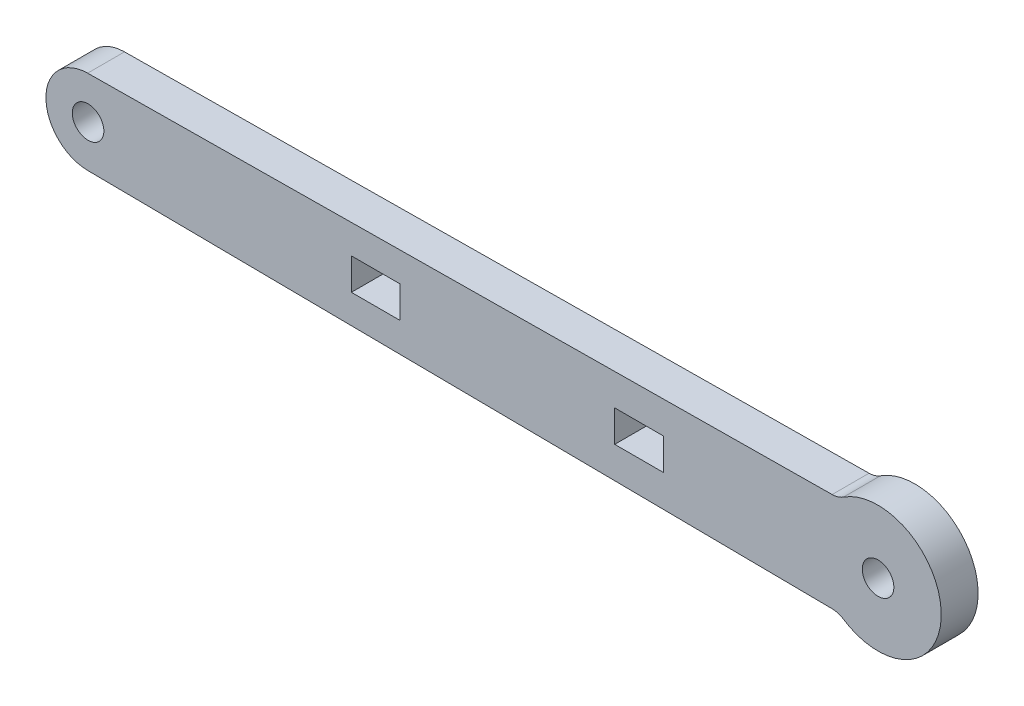
ISO-10303-21;
HEADER;
FILE_DESCRIPTION(('STEP AP214'),'2;1');
FILE_NAME('part.step','',(''),(''),'','','');
FILE_SCHEMA(('AUTOMOTIVE_DESIGN { 1 0 10303 214 1 1 1 1 }'));
ENDSEC;
DATA;
#1=APPLICATION_CONTEXT('core data for automotive mechanical design processes');
#2=APPLICATION_PROTOCOL_DEFINITION('international standard','automotive_design',2000,#1);
#3=PRODUCT_CONTEXT('',#1,'mechanical');
#4=PRODUCT('Part','Part','',(#3));
#5=PRODUCT_RELATED_PRODUCT_CATEGORY('part','',(#4));
#6=PRODUCT_DEFINITION_FORMATION('','',#4);
#7=PRODUCT_DEFINITION_CONTEXT('part definition',#1,'design');
#8=PRODUCT_DEFINITION('design','',#6,#7);
#9=PRODUCT_DEFINITION_SHAPE('','',#8);
#10=(LENGTH_UNIT() NAMED_UNIT(*) SI_UNIT(.MILLI.,.METRE.));
#11=(NAMED_UNIT(*) PLANE_ANGLE_UNIT() SI_UNIT($,.RADIAN.));
#12=(NAMED_UNIT(*) SI_UNIT($,.STERADIAN.) SOLID_ANGLE_UNIT());
#13=UNCERTAINTY_MEASURE_WITH_UNIT(LENGTH_MEASURE(1.E-05),#10,'distance_accuracy_value','');
#14=(GEOMETRIC_REPRESENTATION_CONTEXT(3) GLOBAL_UNCERTAINTY_ASSIGNED_CONTEXT((#13)) GLOBAL_UNIT_ASSIGNED_CONTEXT((#10,
#11,#12)) REPRESENTATION_CONTEXT('',''));
#15=CARTESIAN_POINT('',(0.,0.,0.));
#16=DIRECTION('',(0.,0.,1.));
#17=DIRECTION('',(1.,0.,0.));
#18=AXIS2_PLACEMENT_3D('',#15,#16,#17);
#19=CARTESIAN_POINT('',(-0.0467366776181437,-4.73934084459366,3.5));
#20=DIRECTION('',(0.00986095045635902,0.999951379646079,0.));
#21=DIRECTION('',(-0.999951379646079,0.00986095045635902,0.));
#22=AXIS2_PLACEMENT_3D('',#19,#20,#21);
#23=PLANE('',#22);
#24=DIRECTION('',(0.999951379646079,-0.00986095045635902,0.));
#25=VECTOR('',#24,1.);
#26=CARTESIAN_POINT('',(-0.0467366776181437,-4.73934084459366,0.));
#27=LINE('',#26,#25);
#28=CARTESIAN_POINT('',(-75.0394438018254,-3.99980551858433,0.));
#29=VERTEX_POINT('',#28);
#30=CARTESIAN_POINT('',(-4.35676827767333,-4.69683777000565,0.));
#31=VERTEX_POINT('',#30);
#32=EDGE_CURVE('E226',#29,#31,#27,.T.);
#33=ORIENTED_EDGE('',*,*,#32,.T.);
#34=DIRECTION('',(0.,0.,1.));
#35=VECTOR('',#34,1.);
#36=CARTESIAN_POINT('',(-4.35676827767333,-4.69683777000565,3.5));
#37=LINE('',#36,#35);
#38=CARTESIAN_POINT('',(-4.35676827767333,-4.69683777000565,3.5));
#39=VERTEX_POINT('',#38);
#40=EDGE_CURVE('E257',#31,#39,#37,.T.);
#41=ORIENTED_EDGE('',*,*,#40,.T.);
#42=DIRECTION('',(0.999951379646079,-0.00986095045635902,0.));
#43=VECTOR('',#42,1.);
#44=CARTESIAN_POINT('',(-0.0467366776181437,-4.73934084459366,3.5));
#45=LINE('',#44,#43);
#46=CARTESIAN_POINT('',(-75.0394438018254,-3.99980551858433,3.5));
#47=VERTEX_POINT('',#46);
#48=EDGE_CURVE('E190',#47,#39,#45,.T.);
#49=ORIENTED_EDGE('',*,*,#48,.F.);
#50=DIRECTION('',(0.,0.,-1.));
#51=VECTOR('',#50,1.);
#52=CARTESIAN_POINT('',(-75.0394438018254,-3.99980551858433,3.5));
#53=LINE('',#52,#51);
#54=EDGE_CURVE('E236',#47,#29,#53,.T.);
#55=ORIENTED_EDGE('',*,*,#54,.T.);
#56=EDGE_LOOP('',(#33,#41,#49,#55));
#57=FACE_BOUND('',#56,.T.);
#58=ADVANCED_FACE('F40',(#57),#23,.F.);
#59=CARTESIAN_POINT('',(0.,0.,3.5));
#60=DIRECTION('',(0.,0.,-1.));
#61=DIRECTION('',(-1.,0.,0.));
#62=AXIS2_PLACEMENT_3D('',#59,#60,#61);
#63=CYLINDRICAL_SURFACE('',#62,6.);
#64=CARTESIAN_POINT('',(0.,0.,3.5));
#65=DIRECTION('',(0.,0.,1.));
#66=DIRECTION('',(1.,0.,0.));
#67=AXIS2_PLACEMENT_3D('',#64,#65,#66);
#68=CIRCLE('',#67,6.);
#69=CARTESIAN_POINT('',(-3.28236763393953,-5.02255539697336,3.5));
#70=VERTEX_POINT('',#69);
#71=CARTESIAN_POINT('',(-3.28236763393954,5.02255539697335,3.5));
#72=VERTEX_POINT('',#71);
#73=EDGE_CURVE('E193',#70,#72,#68,.T.);
#74=ORIENTED_EDGE('',*,*,#73,.F.);
#75=DIRECTION('',(0.,0.,-1.));
#76=VECTOR('',#75,1.);
#77=CARTESIAN_POINT('',(-3.28236763393954,-5.02255539697336,3.5));
#78=LINE('',#77,#76);
#79=CARTESIAN_POINT('',(-3.28236763393953,-5.02255539697336,0.));
#80=VERTEX_POINT('',#79);
#81=EDGE_CURVE('E254',#70,#80,#78,.T.);
#82=ORIENTED_EDGE('',*,*,#81,.T.);
#83=CARTESIAN_POINT('',(0.,0.,0.));
#84=DIRECTION('',(0.,0.,1.));
#85=DIRECTION('',(1.,0.,0.));
#86=AXIS2_PLACEMENT_3D('',#83,#84,#85);
#87=CIRCLE('',#86,6.);
#88=CARTESIAN_POINT('',(-3.28236763393954,5.02255539697335,0.));
#89=VERTEX_POINT('',#88);
#90=EDGE_CURVE('E229',#80,#89,#87,.T.);
#91=ORIENTED_EDGE('',*,*,#90,.T.);
#92=DIRECTION('',(0.,0.,-1.));
#93=VECTOR('',#92,1.);
#94=CARTESIAN_POINT('',(-3.28236763393954,5.02255539697335,3.5));
#95=LINE('',#94,#93);
#96=EDGE_CURVE('E242',#89,#72,#95,.F.);
#97=ORIENTED_EDGE('',*,*,#96,.T.);
#98=EDGE_LOOP('',(#74,#82,#91,#97));
#99=FACE_BOUND('',#98,.T.);
#100=ADVANCED_FACE('F272',(#99),#63,.T.);
#101=CARTESIAN_POINT('',(-0.0467366776181448,4.73934084459366,3.5));
#102=DIRECTION('',(-0.00986095045635926,0.999951379646079,0.));
#103=DIRECTION('',(-0.999951379646079,-0.00986095045635926,0.));
#104=AXIS2_PLACEMENT_3D('',#101,#102,#103);
#105=PLANE('',#104);
#106=DIRECTION('',(0.999951379646079,0.00986095045635926,0.));
#107=VECTOR('',#106,1.);
#108=CARTESIAN_POINT('',(-0.0467366776181448,4.73934084459366,3.5));
#109=LINE('',#108,#107);
#110=CARTESIAN_POINT('',(-75.0394438018254,3.99980551858431,3.5));
#111=VERTEX_POINT('',#110);
#112=CARTESIAN_POINT('',(-4.35676827767333,4.69683777000565,3.5));
#113=VERTEX_POINT('',#112);
#114=EDGE_CURVE('E195',#111,#113,#109,.T.);
#115=ORIENTED_EDGE('',*,*,#114,.T.);
#116=DIRECTION('',(0.,0.,-1.));
#117=VECTOR('',#116,1.);
#118=CARTESIAN_POINT('',(-4.35676827767333,4.69683777000565,3.5));
#119=LINE('',#118,#117);
#120=CARTESIAN_POINT('',(-4.35676827767333,4.69683777000565,0.));
#121=VERTEX_POINT('',#120);
#122=EDGE_CURVE('E259',#113,#121,#119,.T.);
#123=ORIENTED_EDGE('',*,*,#122,.T.);
#124=DIRECTION('',(0.999951379646079,0.00986095045635926,0.));
#125=VECTOR('',#124,1.);
#126=CARTESIAN_POINT('',(-0.0467366776181448,4.73934084459366,0.));
#127=LINE('',#126,#125);
#128=CARTESIAN_POINT('',(-75.0394438018254,3.99980551858431,0.));
#129=VERTEX_POINT('',#128);
#130=EDGE_CURVE('E232',#129,#121,#127,.T.);
#131=ORIENTED_EDGE('',*,*,#130,.F.);
#132=DIRECTION('',(0.,0.,-1.));
#133=VECTOR('',#132,1.);
#134=CARTESIAN_POINT('',(-75.0394438018254,3.99980551858431,3.5));
#135=LINE('',#134,#133);
#136=EDGE_CURVE('E239',#111,#129,#135,.T.);
#137=ORIENTED_EDGE('',*,*,#136,.F.);
#138=EDGE_LOOP('',(#115,#123,#131,#137));
#139=FACE_BOUND('',#138,.T.);
#140=ADVANCED_FACE('F275',(#139),#105,.T.);
#141=CARTESIAN_POINT('',(0.,1.50000000000562,3.5));
#142=DIRECTION('',(0.,1.,0.));
#143=DIRECTION('',(0.,0.,1.));
#144=AXIS2_PLACEMENT_3D('',#141,#142,#143);
#145=PLANE('',#144);
#146=DIRECTION('',(1.,0.,0.));
#147=VECTOR('',#146,1.);
#148=CARTESIAN_POINT('',(0.,1.50000000000562,0.));
#149=LINE('',#148,#147);
#150=CARTESIAN_POINT('',(-50.,1.50000000000581,0.));
#151=VERTEX_POINT('',#150);
#152=CARTESIAN_POINT('',(-45.3649163380923,1.50000000000562,0.));
#153=VERTEX_POINT('',#152);
#154=EDGE_CURVE('E208',#151,#153,#149,.T.);
#155=ORIENTED_EDGE('',*,*,#154,.T.);
#156=DIRECTION('',(0.,0.,-1.));
#157=VECTOR('',#156,1.);
#158=CARTESIAN_POINT('',(-45.3649163380923,1.50000000000562,3.5));
#159=LINE('',#158,#157);
#160=CARTESIAN_POINT('',(-45.3649163380923,1.50000000000562,3.5));
#161=VERTEX_POINT('',#160);
#162=EDGE_CURVE('E240',#161,#153,#159,.T.);
#163=ORIENTED_EDGE('',*,*,#162,.F.);
#164=DIRECTION('',(1.,0.,0.));
#165=VECTOR('',#164,1.);
#166=CARTESIAN_POINT('',(0.,1.50000000000562,3.5));
#167=LINE('',#166,#165);
#168=CARTESIAN_POINT('',(-50.,1.50000000000581,3.5));
#169=VERTEX_POINT('',#168);
#170=EDGE_CURVE('E173',#169,#161,#167,.T.);
#171=ORIENTED_EDGE('',*,*,#170,.F.);
#172=DIRECTION('',(0.,0.,-1.));
#173=VECTOR('',#172,1.);
#174=CARTESIAN_POINT('',(-50.,1.50000000000581,3.5));
#175=LINE('',#174,#173);
#176=EDGE_CURVE('E164',#169,#151,#175,.T.);
#177=ORIENTED_EDGE('',*,*,#176,.T.);
#178=EDGE_LOOP('',(#155,#163,#171,#177));
#179=FACE_BOUND('',#178,.T.);
#180=ADVANCED_FACE('F323',(#179),#145,.F.);
#181=CARTESIAN_POINT('',(-45.3649163380923,-1.04927447143217E-13,3.5));
#182=DIRECTION('',(-1.,0.,0.));
#183=DIRECTION('',(0.,-1.,0.));
#184=AXIS2_PLACEMENT_3D('',#181,#182,#183);
#185=PLANE('',#184);
#186=DIRECTION('',(0.,1.,0.));
#187=VECTOR('',#186,1.);
#188=CARTESIAN_POINT('',(-45.3649163380923,-1.04927447143217E-13,0.));
#189=LINE('',#188,#187);
#190=CARTESIAN_POINT('',(-45.3649163380923,-1.49999999999438,0.));
#191=VERTEX_POINT('',#190);
#192=EDGE_CURVE('E211',#191,#153,#189,.T.);
#193=ORIENTED_EDGE('',*,*,#192,.F.);
#194=DIRECTION('',(0.,0.,-1.));
#195=VECTOR('',#194,1.);
#196=CARTESIAN_POINT('',(-45.3649163380923,-1.49999999999438,3.5));
#197=LINE('',#196,#195);
#198=CARTESIAN_POINT('',(-45.3649163380923,-1.49999999999438,3.5));
#199=VERTEX_POINT('',#198);
#200=EDGE_CURVE('E246',#199,#191,#197,.T.);
#201=ORIENTED_EDGE('',*,*,#200,.F.);
#202=DIRECTION('',(0.,1.,0.));
#203=VECTOR('',#202,1.);
#204=CARTESIAN_POINT('',(-45.3649163380923,-1.04927447143217E-13,3.5));
#205=LINE('',#204,#203);
#206=EDGE_CURVE('E175',#199,#161,#205,.T.);
#207=ORIENTED_EDGE('',*,*,#206,.T.);
#208=ORIENTED_EDGE('',*,*,#162,.T.);
#209=EDGE_LOOP('',(#193,#201,#207,#208));
#210=FACE_BOUND('',#209,.T.);
#211=ADVANCED_FACE('F319',(#210),#185,.T.);
#212=CARTESIAN_POINT('',(0.,-1.49999999999419,3.5));
#213=DIRECTION('',(0.,1.,0.));
#214=DIRECTION('',(0.,0.,1.));
#215=AXIS2_PLACEMENT_3D('',#212,#213,#214);
#216=PLANE('',#215);
#217=DIRECTION('',(1.,0.,0.));
#218=VECTOR('',#217,1.);
#219=CARTESIAN_POINT('',(0.,-1.49999999999419,0.));
#220=LINE('',#219,#218);
#221=CARTESIAN_POINT('',(-50.,-1.49999999999419,0.));
#222=VERTEX_POINT('',#221);
#223=EDGE_CURVE('E214',#222,#191,#220,.T.);
#224=ORIENTED_EDGE('',*,*,#223,.F.);
#225=DIRECTION('',(0.,0.,-1.));
#226=VECTOR('',#225,1.);
#227=CARTESIAN_POINT('',(-50.,-1.49999999999419,3.5));
#228=LINE('',#227,#226);
#229=CARTESIAN_POINT('',(-50.,-1.49999999999419,3.5));
#230=VERTEX_POINT('',#229);
#231=EDGE_CURVE('E244',#230,#222,#228,.T.);
#232=ORIENTED_EDGE('',*,*,#231,.F.);
#233=DIRECTION('',(1.,0.,0.));
#234=VECTOR('',#233,1.);
#235=CARTESIAN_POINT('',(0.,-1.49999999999419,3.5));
#236=LINE('',#235,#234);
#237=EDGE_CURVE('E178',#230,#199,#236,.T.);
#238=ORIENTED_EDGE('',*,*,#237,.T.);
#239=ORIENTED_EDGE('',*,*,#200,.T.);
#240=EDGE_LOOP('',(#224,#232,#238,#239));
#241=FACE_BOUND('',#240,.T.);
#242=ADVANCED_FACE('F316',(#241),#216,.T.);
#243=CARTESIAN_POINT('',(0.,1.50000000000562,3.5));
#244=DIRECTION('',(0.,1.,0.));
#245=DIRECTION('',(0.,0.,1.));
#246=AXIS2_PLACEMENT_3D('',#243,#244,#245);
#247=PLANE('',#246);
#248=DIRECTION('',(1.,0.,0.));
#249=VECTOR('',#248,1.);
#250=CARTESIAN_POINT('',(0.,1.50000000000562,0.));
#251=LINE('',#250,#249);
#252=CARTESIAN_POINT('',(-25.,1.50000000000562,0.));
#253=VERTEX_POINT('',#252);
#254=CARTESIAN_POINT('',(-20.3649163380923,1.50000000000562,0.));
#255=VERTEX_POINT('',#254);
#256=EDGE_CURVE('E160',#253,#255,#251,.T.);
#257=ORIENTED_EDGE('',*,*,#256,.T.);
#258=DIRECTION('',(0.,0.,-1.));
#259=VECTOR('',#258,1.);
#260=CARTESIAN_POINT('',(-20.3649163380923,1.50000000000562,3.5));
#261=LINE('',#260,#259);
#262=CARTESIAN_POINT('',(-20.3649163380923,1.50000000000562,3.5));
#263=VERTEX_POINT('',#262);
#264=EDGE_CURVE('E157',#263,#255,#261,.T.);
#265=ORIENTED_EDGE('',*,*,#264,.F.);
#266=DIRECTION('',(1.,0.,0.));
#267=VECTOR('',#266,1.);
#268=CARTESIAN_POINT('',(0.,1.50000000000562,3.5));
#269=LINE('',#268,#267);
#270=CARTESIAN_POINT('',(-25.,1.50000000000562,3.5));
#271=VERTEX_POINT('',#270);
#272=EDGE_CURVE('E141',#271,#263,#269,.T.);
#273=ORIENTED_EDGE('',*,*,#272,.F.);
#274=DIRECTION('',(0.,0.,-1.));
#275=VECTOR('',#274,1.);
#276=CARTESIAN_POINT('',(-25.,1.50000000000562,3.5));
#277=LINE('',#276,#275);
#278=EDGE_CURVE('E199',#271,#253,#277,.T.);
#279=ORIENTED_EDGE('',*,*,#278,.T.);
#280=EDGE_LOOP('',(#257,#265,#273,#279));
#281=FACE_BOUND('',#280,.T.);
#282=ADVANCED_FACE('F158',(#281),#247,.F.);
#283=CARTESIAN_POINT('',(-20.3649163380923,0.,3.5));
#284=DIRECTION('',(-1.,0.,0.));
#285=DIRECTION('',(0.,0.,1.));
#286=AXIS2_PLACEMENT_3D('',#283,#284,#285);
#287=PLANE('',#286);
#288=DIRECTION('',(0.,1.,0.));
#289=VECTOR('',#288,1.);
#290=CARTESIAN_POINT('',(-20.3649163380923,0.,0.));
#291=LINE('',#290,#289);
#292=CARTESIAN_POINT('',(-20.3649163380923,-1.49999999999419,0.));
#293=VERTEX_POINT('',#292);
#294=EDGE_CURVE('E201',#293,#255,#291,.T.);
#295=ORIENTED_EDGE('',*,*,#294,.F.);
#296=DIRECTION('',(0.,0.,-1.));
#297=VECTOR('',#296,1.);
#298=CARTESIAN_POINT('',(-20.3649163380923,-1.49999999999419,3.5));
#299=LINE('',#298,#297);
#300=CARTESIAN_POINT('',(-20.3649163380923,-1.49999999999419,3.5));
#301=VERTEX_POINT('',#300);
#302=EDGE_CURVE('E165',#301,#293,#299,.T.);
#303=ORIENTED_EDGE('',*,*,#302,.F.);
#304=DIRECTION('',(0.,1.,0.));
#305=VECTOR('',#304,1.);
#306=CARTESIAN_POINT('',(-20.3649163380923,0.,3.5));
#307=LINE('',#306,#305);
#308=EDGE_CURVE('E147',#301,#263,#307,.T.);
#309=ORIENTED_EDGE('',*,*,#308,.T.);
#310=ORIENTED_EDGE('',*,*,#264,.T.);
#311=EDGE_LOOP('',(#295,#303,#309,#310));
#312=FACE_BOUND('',#311,.T.);
#313=ADVANCED_FACE('F167',(#312),#287,.T.);
#314=CARTESIAN_POINT('',(0.,-1.49999999999419,3.5));
#315=DIRECTION('',(0.,1.,0.));
#316=DIRECTION('',(0.,0.,1.));
#317=AXIS2_PLACEMENT_3D('',#314,#315,#316);
#318=PLANE('',#317);
#319=DIRECTION('',(1.,0.,0.));
#320=VECTOR('',#319,1.);
#321=CARTESIAN_POINT('',(0.,-1.49999999999419,0.));
#322=LINE('',#321,#320);
#323=CARTESIAN_POINT('',(-25.,-1.49999999999419,0.));
#324=VERTEX_POINT('',#323);
#325=EDGE_CURVE('E203',#324,#293,#322,.T.);
#326=ORIENTED_EDGE('',*,*,#325,.F.);
#327=DIRECTION('',(0.,0.,-1.));
#328=VECTOR('',#327,1.);
#329=CARTESIAN_POINT('',(-25.,-1.49999999999419,3.5));
#330=LINE('',#329,#328);
#331=CARTESIAN_POINT('',(-25.,-1.49999999999419,3.5));
#332=VERTEX_POINT('',#331);
#333=EDGE_CURVE('E250',#332,#324,#330,.T.);
#334=ORIENTED_EDGE('',*,*,#333,.F.);
#335=DIRECTION('',(1.,0.,0.));
#336=VECTOR('',#335,1.);
#337=CARTESIAN_POINT('',(0.,-1.49999999999419,3.5));
#338=LINE('',#337,#336);
#339=EDGE_CURVE('E168',#332,#301,#338,.T.);
#340=ORIENTED_EDGE('',*,*,#339,.T.);
#341=ORIENTED_EDGE('',*,*,#302,.T.);
#342=EDGE_LOOP('',(#326,#334,#340,#341));
#343=FACE_BOUND('',#342,.T.);
#344=ADVANCED_FACE('F306',(#343),#318,.T.);
#345=CARTESIAN_POINT('',(0.,0.,3.5));
#346=DIRECTION('',(0.,0.,-1.));
#347=DIRECTION('',(-1.,0.,0.));
#348=AXIS2_PLACEMENT_3D('',#345,#346,#347);
#349=CYLINDRICAL_SURFACE('',#348,1.5);
#350=CARTESIAN_POINT('',(0.,0.,3.5));
#351=DIRECTION('',(0.,0.,1.));
#352=DIRECTION('',(1.,0.,0.));
#353=AXIS2_PLACEMENT_3D('',#350,#351,#352);
#354=CIRCLE('',#353,1.5);
#355=CARTESIAN_POINT('',(1.5,0.,3.5));
#356=VERTEX_POINT('',#355);
#357=EDGE_CURVE('E187',#356,#356,#354,.T.);
#358=ORIENTED_EDGE('',*,*,#357,.T.);
#359=EDGE_LOOP('',(#358));
#360=FACE_BOUND('',#359,.T.);
#361=CARTESIAN_POINT('',(0.,0.,0.));
#362=DIRECTION('',(0.,0.,1.));
#363=DIRECTION('',(1.,0.,0.));
#364=AXIS2_PLACEMENT_3D('',#361,#362,#363);
#365=CIRCLE('',#364,1.5);
#366=CARTESIAN_POINT('',(1.5,0.,0.));
#367=VERTEX_POINT('',#366);
#368=EDGE_CURVE('E223',#367,#367,#365,.T.);
#369=ORIENTED_EDGE('',*,*,#368,.F.);
#370=EDGE_LOOP('',(#369));
#371=FACE_BOUND('',#370,.T.);
#372=ADVANCED_FACE('F302',(#360,#371),#349,.F.);
#373=CARTESIAN_POINT('',(-75.,0.,3.5));
#374=DIRECTION('',(0.,0.,-1.));
#375=DIRECTION('',(-1.,0.,0.));
#376=AXIS2_PLACEMENT_3D('',#373,#374,#375);
#377=CYLINDRICAL_SURFACE('',#376,1.5);
#378=CARTESIAN_POINT('',(-75.,0.,3.5));
#379=DIRECTION('',(0.,0.,1.));
#380=DIRECTION('',(1.,0.,0.));
#381=AXIS2_PLACEMENT_3D('',#378,#379,#380);
#382=CIRCLE('',#381,1.5);
#383=CARTESIAN_POINT('',(-73.5,0.,3.5));
#384=VERTEX_POINT('',#383);
#385=EDGE_CURVE('E184',#384,#384,#382,.T.);
#386=ORIENTED_EDGE('',*,*,#385,.T.);
#387=EDGE_LOOP('',(#386));
#388=FACE_BOUND('',#387,.T.);
#389=CARTESIAN_POINT('',(-75.,0.,0.));
#390=DIRECTION('',(0.,0.,1.));
#391=DIRECTION('',(1.,0.,0.));
#392=AXIS2_PLACEMENT_3D('',#389,#390,#391);
#393=CIRCLE('',#392,1.5);
#394=CARTESIAN_POINT('',(-73.5,0.,0.));
#395=VERTEX_POINT('',#394);
#396=EDGE_CURVE('E220',#395,#395,#393,.T.);
#397=ORIENTED_EDGE('',*,*,#396,.F.);
#398=EDGE_LOOP('',(#397));
#399=FACE_BOUND('',#398,.T.);
#400=ADVANCED_FACE('F305',(#388,#399),#377,.F.);
#401=CARTESIAN_POINT('',(-50.,0.,3.5));
#402=DIRECTION('',(1.,0.,0.));
#403=DIRECTION('',(0.,0.,-1.));
#404=AXIS2_PLACEMENT_3D('',#401,#402,#403);
#405=PLANE('',#404);
#406=DIRECTION('',(0.,-1.,0.));
#407=VECTOR('',#406,1.);
#408=CARTESIAN_POINT('',(-50.,0.,0.));
#409=LINE('',#408,#407);
#410=EDGE_CURVE('E217',#151,#222,#409,.T.);
#411=ORIENTED_EDGE('',*,*,#410,.F.);
#412=ORIENTED_EDGE('',*,*,#176,.F.);
#413=DIRECTION('',(0.,-1.,0.));
#414=VECTOR('',#413,1.);
#415=CARTESIAN_POINT('',(-50.,0.,3.5));
#416=LINE('',#415,#414);
#417=EDGE_CURVE('E180',#169,#230,#416,.T.);
#418=ORIENTED_EDGE('',*,*,#417,.T.);
#419=ORIENTED_EDGE('',*,*,#231,.T.);
#420=EDGE_LOOP('',(#411,#412,#418,#419));
#421=FACE_BOUND('',#420,.T.);
#422=ADVANCED_FACE('F310',(#421),#405,.T.);
#423=CARTESIAN_POINT('',(-25.,0.,3.5));
#424=DIRECTION('',(-1.,0.,0.));
#425=DIRECTION('',(0.,0.,1.));
#426=AXIS2_PLACEMENT_3D('',#423,#424,#425);
#427=PLANE('',#426);
#428=DIRECTION('',(0.,1.,0.));
#429=VECTOR('',#428,1.);
#430=CARTESIAN_POINT('',(-25.,0.,0.));
#431=LINE('',#430,#429);
#432=EDGE_CURVE('E206',#324,#253,#431,.T.);
#433=ORIENTED_EDGE('',*,*,#432,.T.);
#434=ORIENTED_EDGE('',*,*,#278,.F.);
#435=DIRECTION('',(0.,1.,0.));
#436=VECTOR('',#435,1.);
#437=CARTESIAN_POINT('',(-25.,0.,3.5));
#438=LINE('',#437,#436);
#439=EDGE_CURVE('E150',#332,#271,#438,.T.);
#440=ORIENTED_EDGE('',*,*,#439,.F.);
#441=ORIENTED_EDGE('',*,*,#333,.T.);
#442=EDGE_LOOP('',(#433,#434,#440,#441));
#443=FACE_BOUND('',#442,.T.);
#444=ADVANCED_FACE('F314',(#443),#427,.F.);
#445=CARTESIAN_POINT('',(-75.,0.,3.5));
#446=DIRECTION('',(0.,0.,-1.));
#447=DIRECTION('',(-1.,0.,0.));
#448=AXIS2_PLACEMENT_3D('',#445,#446,#447);
#449=CYLINDRICAL_SURFACE('',#448,4.);
#450=CARTESIAN_POINT('',(-75.,0.,0.));
#451=DIRECTION('',(0.,0.,1.));
#452=DIRECTION('',(1.,0.,0.));
#453=AXIS2_PLACEMENT_3D('',#450,#451,#452);
#454=CIRCLE('',#453,4.);
#455=EDGE_CURVE('E154',#129,#29,#454,.T.);
#456=ORIENTED_EDGE('',*,*,#455,.T.);
#457=ORIENTED_EDGE('',*,*,#54,.F.);
#458=CARTESIAN_POINT('',(-75.,0.,3.5));
#459=DIRECTION('',(0.,0.,1.));
#460=DIRECTION('',(1.,0.,0.));
#461=AXIS2_PLACEMENT_3D('',#458,#459,#460);
#462=CIRCLE('',#461,4.);
#463=EDGE_CURVE('E197',#111,#47,#462,.T.);
#464=ORIENTED_EDGE('',*,*,#463,.F.);
#465=ORIENTED_EDGE('',*,*,#136,.T.);
#466=EDGE_LOOP('',(#456,#457,#464,#465));
#467=FACE_BOUND('',#466,.T.);
#468=ADVANCED_FACE('F281',(#467),#449,.T.);
#469=CARTESIAN_POINT('',(0.,0.,3.5));
#470=DIRECTION('',(0.,0.,1.));
#471=DIRECTION('',(1.,0.,0.));
#472=AXIS2_PLACEMENT_3D('',#469,#470,#471);
#473=PLANE('',#472);
#474=ORIENTED_EDGE('',*,*,#272,.T.);
#475=ORIENTED_EDGE('',*,*,#308,.F.);
#476=ORIENTED_EDGE('',*,*,#339,.F.);
#477=ORIENTED_EDGE('',*,*,#439,.T.);
#478=EDGE_LOOP('',(#474,#475,#476,#477));
#479=FACE_BOUND('',#478,.T.);
#480=ORIENTED_EDGE('',*,*,#170,.T.);
#481=ORIENTED_EDGE('',*,*,#206,.F.);
#482=ORIENTED_EDGE('',*,*,#237,.F.);
#483=ORIENTED_EDGE('',*,*,#417,.F.);
#484=EDGE_LOOP('',(#480,#481,#482,#483));
#485=FACE_BOUND('',#484,.T.);
#486=ORIENTED_EDGE('',*,*,#385,.F.);
#487=EDGE_LOOP('',(#486));
#488=FACE_BOUND('',#487,.T.);
#489=ORIENTED_EDGE('',*,*,#357,.F.);
#490=EDGE_LOOP('',(#489));
#491=FACE_BOUND('',#490,.T.);
#492=ORIENTED_EDGE('',*,*,#48,.T.);
#493=CARTESIAN_POINT('',(-4.37649017858605,-6.69674052929781,3.5));
#494=DIRECTION('',(0.,0.,1.));
#495=DIRECTION('',(1.,0.,0.));
#496=AXIS2_PLACEMENT_3D('',#493,#494,#495);
#497=CIRCLE('',#496,2.);
#498=EDGE_CURVE('E263',#39,#70,#497,.F.);
#499=ORIENTED_EDGE('',*,*,#498,.T.);
#500=ORIENTED_EDGE('',*,*,#73,.T.);
#501=CARTESIAN_POINT('',(-4.37649017858605,6.6967405292978,3.5));
#502=DIRECTION('',(0.,0.,1.));
#503=DIRECTION('',(1.,0.,0.));
#504=AXIS2_PLACEMENT_3D('',#501,#502,#503);
#505=CIRCLE('',#504,2.);
#506=EDGE_CURVE('E12',#72,#113,#505,.F.);
#507=ORIENTED_EDGE('',*,*,#506,.T.);
#508=ORIENTED_EDGE('',*,*,#114,.F.);
#509=ORIENTED_EDGE('',*,*,#463,.T.);
#510=EDGE_LOOP('',(#492,#499,#500,#507,#508,#509));
#511=FACE_BOUND('',#510,.T.);
#512=ADVANCED_FACE('F143',(#479,#485,#488,#491,#511),#473,.T.);
#513=CARTESIAN_POINT('',(0.,0.,0.));
#514=DIRECTION('',(0.,0.,1.));
#515=DIRECTION('',(1.,0.,0.));
#516=AXIS2_PLACEMENT_3D('',#513,#514,#515);
#517=PLANE('',#516);
#518=ORIENTED_EDGE('',*,*,#256,.F.);
#519=ORIENTED_EDGE('',*,*,#432,.F.);
#520=ORIENTED_EDGE('',*,*,#325,.T.);
#521=ORIENTED_EDGE('',*,*,#294,.T.);
#522=EDGE_LOOP('',(#518,#519,#520,#521));
#523=FACE_BOUND('',#522,.T.);
#524=ORIENTED_EDGE('',*,*,#154,.F.);
#525=ORIENTED_EDGE('',*,*,#410,.T.);
#526=ORIENTED_EDGE('',*,*,#223,.T.);
#527=ORIENTED_EDGE('',*,*,#192,.T.);
#528=EDGE_LOOP('',(#524,#525,#526,#527));
#529=FACE_BOUND('',#528,.T.);
#530=ORIENTED_EDGE('',*,*,#396,.T.);
#531=EDGE_LOOP('',(#530));
#532=FACE_BOUND('',#531,.T.);
#533=ORIENTED_EDGE('',*,*,#368,.T.);
#534=EDGE_LOOP('',(#533));
#535=FACE_BOUND('',#534,.T.);
#536=ORIENTED_EDGE('',*,*,#32,.F.);
#537=ORIENTED_EDGE('',*,*,#455,.F.);
#538=ORIENTED_EDGE('',*,*,#130,.T.);
#539=CARTESIAN_POINT('',(-4.37649017858605,6.6967405292978,0.));
#540=DIRECTION('',(0.,0.,1.));
#541=DIRECTION('',(1.,0.,0.));
#542=AXIS2_PLACEMENT_3D('',#539,#540,#541);
#543=CIRCLE('',#542,2.);
#544=EDGE_CURVE('E48',#121,#89,#543,.T.);
#545=ORIENTED_EDGE('',*,*,#544,.T.);
#546=ORIENTED_EDGE('',*,*,#90,.F.);
#547=CARTESIAN_POINT('',(-4.37649017858605,-6.69674052929781,0.));
#548=DIRECTION('',(0.,0.,1.));
#549=DIRECTION('',(1.,0.,0.));
#550=AXIS2_PLACEMENT_3D('',#547,#548,#549);
#551=CIRCLE('',#550,2.);
#552=EDGE_CURVE('E261',#80,#31,#551,.T.);
#553=ORIENTED_EDGE('',*,*,#552,.T.);
#554=EDGE_LOOP('',(#536,#537,#538,#545,#546,#553));
#555=FACE_BOUND('',#554,.T.);
#556=ADVANCED_FACE('F267',(#523,#529,#532,#535,#555),#517,.F.);
#557=CARTESIAN_POINT('',(-4.37649017858605,-6.69674052929781,3.5));
#558=DIRECTION('',(0.,0.,-1.));
#559=DIRECTION('',(-1.,0.,0.));
#560=AXIS2_PLACEMENT_3D('',#557,#558,#559);
#561=CYLINDRICAL_SURFACE('',#560,2.);
#562=ORIENTED_EDGE('',*,*,#498,.F.);
#563=ORIENTED_EDGE('',*,*,#40,.F.);
#564=ORIENTED_EDGE('',*,*,#552,.F.);
#565=ORIENTED_EDGE('',*,*,#81,.F.);
#566=EDGE_LOOP('',(#562,#563,#564,#565));
#567=FACE_BOUND('',#566,.T.);
#568=ADVANCED_FACE('F285',(#567),#561,.F.);
#569=CARTESIAN_POINT('',(-4.37649017858605,6.6967405292978,3.5));
#570=DIRECTION('',(0.,0.,-1.));
#571=DIRECTION('',(-1.,0.,0.));
#572=AXIS2_PLACEMENT_3D('',#569,#570,#571);
#573=CYLINDRICAL_SURFACE('',#572,2.);
#574=ORIENTED_EDGE('',*,*,#506,.F.);
#575=ORIENTED_EDGE('',*,*,#96,.F.);
#576=ORIENTED_EDGE('',*,*,#544,.F.);
#577=ORIENTED_EDGE('',*,*,#122,.F.);
#578=EDGE_LOOP('',(#574,#575,#576,#577));
#579=FACE_BOUND('',#578,.T.);
#580=ADVANCED_FACE('F42',(#579),#573,.F.);
#581=CLOSED_SHELL('',(#58,#100,#140,#180,#211,#242,#282,#313,#344,#372,#400,#422,#444,#468,#512,
#556,#568,#580));
#582=MANIFOLD_SOLID_BREP('B2',#581);
#583=ADVANCED_BREP_SHAPE_REPRESENTATION('',(#18,#582),#14);
#584=SHAPE_DEFINITION_REPRESENTATION(#9,#583);
ENDSEC;
END-ISO-10303-21;
